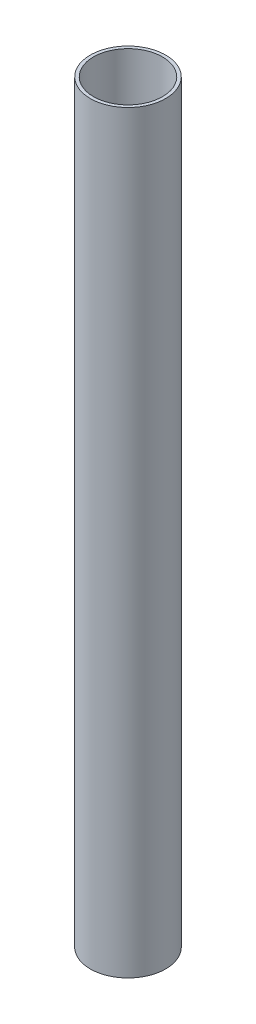
ISO-10303-21;
HEADER;
FILE_DESCRIPTION(('STEP AP214'),'2;1');
FILE_NAME('part.step','',(''),(''),'','','');
FILE_SCHEMA(('AUTOMOTIVE_DESIGN { 1 0 10303 214 1 1 1 1 }'));
ENDSEC;
DATA;
#1=APPLICATION_CONTEXT('core data for automotive mechanical design processes');
#2=APPLICATION_PROTOCOL_DEFINITION('international standard','automotive_design',2000,#1);
#3=PRODUCT_CONTEXT('',#1,'mechanical');
#4=PRODUCT('Part','Part','',(#3));
#5=PRODUCT_RELATED_PRODUCT_CATEGORY('part','',(#4));
#6=PRODUCT_DEFINITION_FORMATION('','',#4);
#7=PRODUCT_DEFINITION_CONTEXT('part definition',#1,'design');
#8=PRODUCT_DEFINITION('design','',#6,#7);
#9=PRODUCT_DEFINITION_SHAPE('','',#8);
#10=(LENGTH_UNIT() NAMED_UNIT(*) SI_UNIT(.MILLI.,.METRE.));
#11=(NAMED_UNIT(*) PLANE_ANGLE_UNIT() SI_UNIT($,.RADIAN.));
#12=(NAMED_UNIT(*) SI_UNIT($,.STERADIAN.) SOLID_ANGLE_UNIT());
#13=UNCERTAINTY_MEASURE_WITH_UNIT(LENGTH_MEASURE(1.E-05),#10,'distance_accuracy_value','');
#14=(GEOMETRIC_REPRESENTATION_CONTEXT(3) GLOBAL_UNCERTAINTY_ASSIGNED_CONTEXT((#13)) GLOBAL_UNIT_ASSIGNED_CONTEXT((#10,
#11,#12)) REPRESENTATION_CONTEXT('',''));
#15=CARTESIAN_POINT('',(0.,0.,0.));
#16=DIRECTION('',(0.,0.,1.));
#17=DIRECTION('',(1.,0.,0.));
#18=AXIS2_PLACEMENT_3D('',#15,#16,#17);
#19=CARTESIAN_POINT('',(0.,1500.,0.));
#20=DIRECTION('',(0.,1.,0.));
#21=DIRECTION('',(0.,0.,1.));
#22=AXIS2_PLACEMENT_3D('',#19,#20,#21);
#23=PLANE('',#22);
#24=CARTESIAN_POINT('',(0.,1500.,0.));
#25=DIRECTION('',(0.,1.,0.));
#26=DIRECTION('',(0.,0.,1.));
#27=AXIS2_PLACEMENT_3D('',#24,#25,#26);
#28=CIRCLE('',#27,75.);
#29=CARTESIAN_POINT('',(0.,1500.,75.));
#30=VERTEX_POINT('',#29);
#31=EDGE_CURVE('E10',#30,#30,#28,.T.);
#32=ORIENTED_EDGE('',*,*,#31,.T.);
#33=EDGE_LOOP('',(#32));
#34=FACE_BOUND('',#33,.T.);
#35=CARTESIAN_POINT('',(0.,1500.,0.));
#36=DIRECTION('',(0.,1.,0.));
#37=DIRECTION('',(0.,0.,1.));
#38=AXIS2_PLACEMENT_3D('',#35,#36,#37);
#39=CIRCLE('',#38,68.65);
#40=CARTESIAN_POINT('',(0.,1500.,68.65));
#41=VERTEX_POINT('',#40);
#42=EDGE_CURVE('E43',#41,#41,#39,.T.);
#43=ORIENTED_EDGE('',*,*,#42,.F.);
#44=EDGE_LOOP('',(#43));
#45=FACE_BOUND('',#44,.T.);
#46=ADVANCED_FACE('F32',(#34,#45),#23,.T.);
#47=CARTESIAN_POINT('',(0.,0.,0.));
#48=DIRECTION('',(0.,1.,0.));
#49=DIRECTION('',(0.,0.,1.));
#50=AXIS2_PLACEMENT_3D('',#47,#48,#49);
#51=PLANE('',#50);
#52=CARTESIAN_POINT('',(0.,0.,0.));
#53=DIRECTION('',(0.,1.,0.));
#54=DIRECTION('',(0.,0.,1.));
#55=AXIS2_PLACEMENT_3D('',#52,#53,#54);
#56=CIRCLE('',#55,75.);
#57=CARTESIAN_POINT('',(0.,0.,75.));
#58=VERTEX_POINT('',#57);
#59=EDGE_CURVE('E36',#58,#58,#56,.T.);
#60=ORIENTED_EDGE('',*,*,#59,.F.);
#61=EDGE_LOOP('',(#60));
#62=FACE_BOUND('',#61,.T.);
#63=CARTESIAN_POINT('',(0.,0.,0.));
#64=DIRECTION('',(0.,1.,0.));
#65=DIRECTION('',(0.,0.,1.));
#66=AXIS2_PLACEMENT_3D('',#63,#64,#65);
#67=CIRCLE('',#66,68.65);
#68=CARTESIAN_POINT('',(0.,0.,68.65));
#69=VERTEX_POINT('',#68);
#70=EDGE_CURVE('E45',#69,#69,#67,.T.);
#71=ORIENTED_EDGE('',*,*,#70,.T.);
#72=EDGE_LOOP('',(#71));
#73=FACE_BOUND('',#72,.T.);
#74=ADVANCED_FACE('F55',(#62,#73),#51,.F.);
#75=CARTESIAN_POINT('',(0.,1500.,0.));
#76=DIRECTION('',(0.,-1.,0.));
#77=DIRECTION('',(0.,0.,-1.));
#78=AXIS2_PLACEMENT_3D('',#75,#76,#77);
#79=CYLINDRICAL_SURFACE('',#78,75.);
#80=ORIENTED_EDGE('',*,*,#31,.F.);
#81=EDGE_LOOP('',(#80));
#82=FACE_BOUND('',#81,.T.);
#83=ORIENTED_EDGE('',*,*,#59,.T.);
#84=EDGE_LOOP('',(#83));
#85=FACE_BOUND('',#84,.T.);
#86=ADVANCED_FACE('F34',(#82,#85),#79,.T.);
#87=CARTESIAN_POINT('',(0.,1500.,0.));
#88=DIRECTION('',(0.,-1.,0.));
#89=DIRECTION('',(0.,0.,-1.));
#90=AXIS2_PLACEMENT_3D('',#87,#88,#89);
#91=CYLINDRICAL_SURFACE('',#90,68.65);
#92=ORIENTED_EDGE('',*,*,#42,.T.);
#93=EDGE_LOOP('',(#92));
#94=FACE_BOUND('',#93,.T.);
#95=ORIENTED_EDGE('',*,*,#70,.F.);
#96=EDGE_LOOP('',(#95));
#97=FACE_BOUND('',#96,.T.);
#98=ADVANCED_FACE('F51',(#94,#97),#91,.F.);
#99=CLOSED_SHELL('',(#46,#74,#86,#98));
#100=MANIFOLD_SOLID_BREP('B2',#99);
#101=ADVANCED_BREP_SHAPE_REPRESENTATION('',(#18,#100),#14);
#102=SHAPE_DEFINITION_REPRESENTATION(#9,#101);
ENDSEC;
END-ISO-10303-21;
